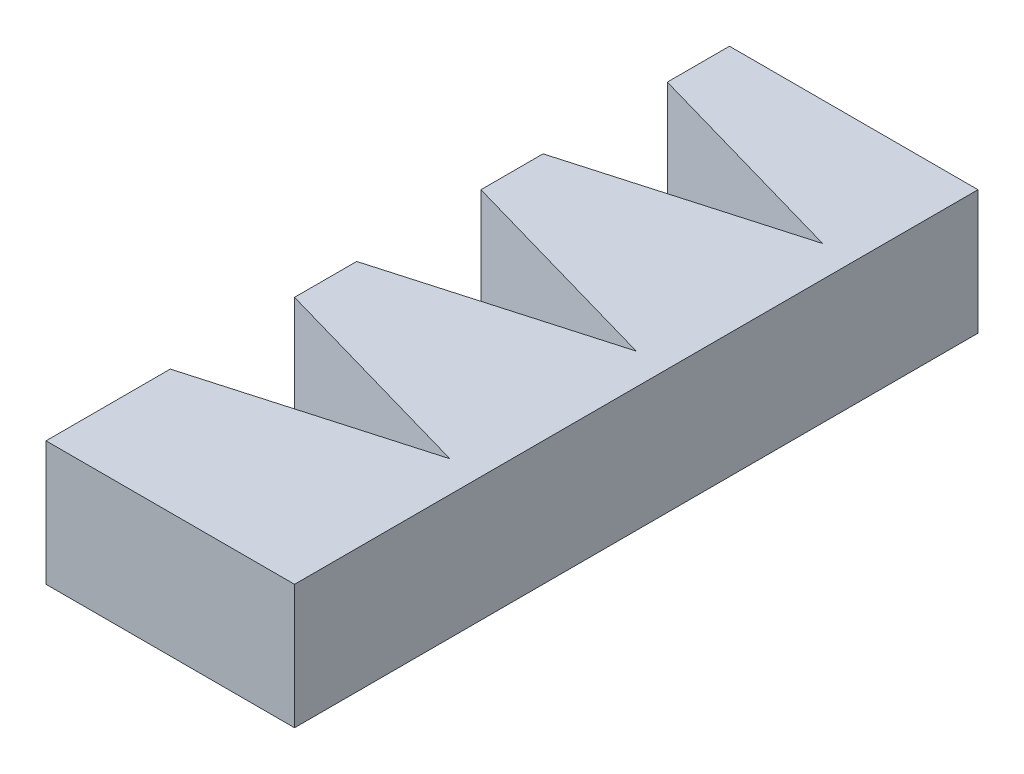
ISO-10303-21;
HEADER;
FILE_DESCRIPTION(('STEP AP214'),'2;1');
FILE_NAME('part.step','',(''),(''),'','','');
FILE_SCHEMA(('AUTOMOTIVE_DESIGN { 1 0 10303 214 1 1 1 1 }'));
ENDSEC;
DATA;
#1=APPLICATION_CONTEXT('core data for automotive mechanical design processes');
#2=APPLICATION_PROTOCOL_DEFINITION('international standard','automotive_design',2000,#1);
#3=PRODUCT_CONTEXT('',#1,'mechanical');
#4=PRODUCT('Part','Part','',(#3));
#5=PRODUCT_RELATED_PRODUCT_CATEGORY('part','',(#4));
#6=PRODUCT_DEFINITION_FORMATION('','',#4);
#7=PRODUCT_DEFINITION_CONTEXT('part definition',#1,'design');
#8=PRODUCT_DEFINITION('design','',#6,#7);
#9=PRODUCT_DEFINITION_SHAPE('','',#8);
#10=(LENGTH_UNIT() NAMED_UNIT(*) SI_UNIT(.MILLI.,.METRE.));
#11=(NAMED_UNIT(*) PLANE_ANGLE_UNIT() SI_UNIT($,.RADIAN.));
#12=(NAMED_UNIT(*) SI_UNIT($,.STERADIAN.) SOLID_ANGLE_UNIT());
#13=UNCERTAINTY_MEASURE_WITH_UNIT(LENGTH_MEASURE(1.E-05),#10,'distance_accuracy_value','');
#14=(GEOMETRIC_REPRESENTATION_CONTEXT(3) GLOBAL_UNCERTAINTY_ASSIGNED_CONTEXT((#13)) GLOBAL_UNIT_ASSIGNED_CONTEXT((#10,
#11,#12)) REPRESENTATION_CONTEXT('',''));
#15=CARTESIAN_POINT('',(0.,0.,0.));
#16=DIRECTION('',(0.,0.,1.));
#17=DIRECTION('',(1.,0.,0.));
#18=AXIS2_PLACEMENT_3D('',#15,#16,#17);
#19=CARTESIAN_POINT('',(0.,20.,0.));
#20=DIRECTION('',(1.,0.,0.));
#21=DIRECTION('',(0.,0.,-1.));
#22=AXIS2_PLACEMENT_3D('',#19,#20,#21);
#23=PLANE('',#22);
#24=DIRECTION('',(0.,0.,1.));
#25=VECTOR('',#24,1.);
#26=CARTESIAN_POINT('',(0.,0.,0.));
#27=LINE('',#26,#25);
#28=CARTESIAN_POINT('',(0.,0.,-20.));
#29=VERTEX_POINT('',#28);
#30=CARTESIAN_POINT('',(0.,0.,0.));
#31=VERTEX_POINT('',#30);
#32=EDGE_CURVE('E159',#29,#31,#27,.T.);
#33=ORIENTED_EDGE('',*,*,#32,.T.);
#34=DIRECTION('',(0.,-1.,0.));
#35=VECTOR('',#34,1.);
#36=CARTESIAN_POINT('',(0.,20.,0.));
#37=LINE('',#36,#35);
#38=CARTESIAN_POINT('',(0.,20.,0.));
#39=VERTEX_POINT('',#38);
#40=EDGE_CURVE('E11',#39,#31,#37,.T.);
#41=ORIENTED_EDGE('',*,*,#40,.F.);
#42=DIRECTION('',(0.,0.,1.));
#43=VECTOR('',#42,1.);
#44=CARTESIAN_POINT('',(0.,20.,0.));
#45=LINE('',#44,#43);
#46=CARTESIAN_POINT('',(0.,20.,-20.));
#47=VERTEX_POINT('',#46);
#48=EDGE_CURVE('E184',#47,#39,#45,.T.);
#49=ORIENTED_EDGE('',*,*,#48,.F.);
#50=DIRECTION('',(0.,-1.,0.));
#51=VECTOR('',#50,1.);
#52=CARTESIAN_POINT('',(0.,20.,-20.));
#53=LINE('',#52,#51);
#54=EDGE_CURVE('E155',#47,#29,#53,.T.);
#55=ORIENTED_EDGE('',*,*,#54,.T.);
#56=EDGE_LOOP('',(#33,#41,#49,#55));
#57=FACE_BOUND('',#56,.T.);
#58=ADVANCED_FACE('F33',(#57),#23,.F.);
#59=CARTESIAN_POINT('',(0.,20.,0.));
#60=DIRECTION('',(0.,0.,-1.));
#61=DIRECTION('',(-1.,0.,0.));
#62=AXIS2_PLACEMENT_3D('',#59,#60,#61);
#63=PLANE('',#62);
#64=DIRECTION('',(1.,0.,0.));
#65=VECTOR('',#64,1.);
#66=CARTESIAN_POINT('',(0.,0.,0.));
#67=LINE('',#66,#65);
#68=CARTESIAN_POINT('',(40.,0.,0.));
#69=VERTEX_POINT('',#68);
#70=EDGE_CURVE('E162',#31,#69,#67,.T.);
#71=ORIENTED_EDGE('',*,*,#70,.T.);
#72=DIRECTION('',(0.,-1.,0.));
#73=VECTOR('',#72,1.);
#74=CARTESIAN_POINT('',(40.,20.,0.));
#75=LINE('',#74,#73);
#76=CARTESIAN_POINT('',(40.,20.,0.));
#77=VERTEX_POINT('',#76);
#78=EDGE_CURVE('E41',#77,#69,#75,.T.);
#79=ORIENTED_EDGE('',*,*,#78,.F.);
#80=DIRECTION('',(1.,0.,0.));
#81=VECTOR('',#80,1.);
#82=CARTESIAN_POINT('',(0.,20.,0.));
#83=LINE('',#82,#81);
#84=EDGE_CURVE('E107',#39,#77,#83,.T.);
#85=ORIENTED_EDGE('',*,*,#84,.F.);
#86=ORIENTED_EDGE('',*,*,#40,.T.);
#87=EDGE_LOOP('',(#71,#79,#85,#86));
#88=FACE_BOUND('',#87,.T.);
#89=ADVANCED_FACE('F266',(#88),#63,.F.);
#90=CARTESIAN_POINT('',(40.,20.,0.));
#91=DIRECTION('',(-1.,0.,0.));
#92=DIRECTION('',(0.,0.,1.));
#93=AXIS2_PLACEMENT_3D('',#90,#91,#92);
#94=PLANE('',#93);
#95=DIRECTION('',(0.,0.,-1.));
#96=VECTOR('',#95,1.);
#97=CARTESIAN_POINT('',(40.,0.,0.));
#98=LINE('',#97,#96);
#99=CARTESIAN_POINT('',(40.,0.,-110.));
#100=VERTEX_POINT('',#99);
#101=EDGE_CURVE('E164',#69,#100,#98,.T.);
#102=ORIENTED_EDGE('',*,*,#101,.T.);
#103=DIRECTION('',(0.,-1.,0.));
#104=VECTOR('',#103,1.);
#105=CARTESIAN_POINT('',(40.,20.,-110.));
#106=LINE('',#105,#104);
#107=CARTESIAN_POINT('',(40.,20.,-110.));
#108=VERTEX_POINT('',#107);
#109=EDGE_CURVE('E206',#108,#100,#106,.T.);
#110=ORIENTED_EDGE('',*,*,#109,.F.);
#111=DIRECTION('',(0.,0.,-1.));
#112=VECTOR('',#111,1.);
#113=CARTESIAN_POINT('',(40.,20.,0.));
#114=LINE('',#113,#112);
#115=EDGE_CURVE('E214',#77,#108,#114,.T.);
#116=ORIENTED_EDGE('',*,*,#115,.F.);
#117=ORIENTED_EDGE('',*,*,#78,.T.);
#118=EDGE_LOOP('',(#102,#110,#116,#117));
#119=FACE_BOUND('',#118,.T.);
#120=ADVANCED_FACE('F212',(#119),#94,.F.);
#121=CARTESIAN_POINT('',(-3.77327389877434E-13,20.,-110.));
#122=DIRECTION('',(0.,0.,1.));
#123=DIRECTION('',(1.,0.,0.));
#124=AXIS2_PLACEMENT_3D('',#121,#122,#123);
#125=PLANE('',#124);
#126=DIRECTION('',(-1.,0.,0.));
#127=VECTOR('',#126,1.);
#128=CARTESIAN_POINT('',(-3.77327389877434E-13,0.,-110.));
#129=LINE('',#128,#127);
#130=CARTESIAN_POINT('',(-3.77327389877434E-13,0.,-110.));
#131=VERTEX_POINT('',#130);
#132=EDGE_CURVE('E167',#100,#131,#129,.T.);
#133=ORIENTED_EDGE('',*,*,#132,.T.);
#134=DIRECTION('',(0.,-1.,0.));
#135=VECTOR('',#134,1.);
#136=CARTESIAN_POINT('',(-3.77327389877434E-13,20.,-110.));
#137=LINE('',#136,#135);
#138=CARTESIAN_POINT('',(-3.77327389877434E-13,20.,-110.));
#139=VERTEX_POINT('',#138);
#140=EDGE_CURVE('E203',#139,#131,#137,.T.);
#141=ORIENTED_EDGE('',*,*,#140,.F.);
#142=DIRECTION('',(-1.,0.,0.));
#143=VECTOR('',#142,1.);
#144=CARTESIAN_POINT('',(35.,20.,-110.));
#145=LINE('',#144,#143);
#146=EDGE_CURVE('E231',#108,#139,#145,.T.);
#147=ORIENTED_EDGE('',*,*,#146,.F.);
#148=ORIENTED_EDGE('',*,*,#109,.T.);
#149=EDGE_LOOP('',(#133,#141,#147,#148));
#150=FACE_BOUND('',#149,.T.);
#151=ADVANCED_FACE('F222',(#150),#125,.F.);
#152=CARTESIAN_POINT('',(-3.43024899888577E-13,20.,-100.));
#153=DIRECTION('',(1.,0.,0.));
#154=DIRECTION('',(0.,0.,-1.));
#155=AXIS2_PLACEMENT_3D('',#152,#153,#154);
#156=PLANE('',#155);
#157=DIRECTION('',(0.,0.,1.));
#158=VECTOR('',#157,1.);
#159=CARTESIAN_POINT('',(-3.43024899888577E-13,0.,-100.));
#160=LINE('',#159,#158);
#161=CARTESIAN_POINT('',(-3.43024899888577E-13,0.,-100.));
#162=VERTEX_POINT('',#161);
#163=EDGE_CURVE('E169',#131,#162,#160,.T.);
#164=ORIENTED_EDGE('',*,*,#163,.T.);
#165=DIRECTION('',(0.,-1.,0.));
#166=VECTOR('',#165,1.);
#167=CARTESIAN_POINT('',(-3.43024899888577E-13,20.,-100.));
#168=LINE('',#167,#166);
#169=CARTESIAN_POINT('',(-3.43024899888577E-13,20.,-100.));
#170=VERTEX_POINT('',#169);
#171=EDGE_CURVE('E200',#170,#162,#168,.T.);
#172=ORIENTED_EDGE('',*,*,#171,.F.);
#173=DIRECTION('',(0.,0.,1.));
#174=VECTOR('',#173,1.);
#175=CARTESIAN_POINT('',(-3.43024899888577E-13,20.,-100.));
#176=LINE('',#175,#174);
#177=EDGE_CURVE('E228',#139,#170,#176,.T.);
#178=ORIENTED_EDGE('',*,*,#177,.F.);
#179=ORIENTED_EDGE('',*,*,#140,.T.);
#180=EDGE_LOOP('',(#164,#172,#178,#179));
#181=FACE_BOUND('',#180,.T.);
#182=ADVANCED_FACE('F226',(#181),#156,.F.);
#183=CARTESIAN_POINT('',(35.,20.,-90.));
#184=DIRECTION('',(0.274721127897376,0.,-0.961523947640824));
#185=DIRECTION('',(-0.961523947640824,0.,-0.274721127897376));
#186=AXIS2_PLACEMENT_3D('',#183,#184,#185);
#187=PLANE('',#186);
#188=DIRECTION('',(0.961523947640824,0.,0.274721127897376));
#189=VECTOR('',#188,1.);
#190=CARTESIAN_POINT('',(35.,0.,-90.));
#191=LINE('',#190,#189);
#192=CARTESIAN_POINT('',(35.,0.,-90.));
#193=VERTEX_POINT('',#192);
#194=EDGE_CURVE('E171',#162,#193,#191,.T.);
#195=ORIENTED_EDGE('',*,*,#194,.T.);
#196=DIRECTION('',(0.,-1.,0.));
#197=VECTOR('',#196,1.);
#198=CARTESIAN_POINT('',(35.,20.,-90.));
#199=LINE('',#198,#197);
#200=CARTESIAN_POINT('',(35.,20.,-90.));
#201=VERTEX_POINT('',#200);
#202=EDGE_CURVE('E197',#201,#193,#199,.T.);
#203=ORIENTED_EDGE('',*,*,#202,.F.);
#204=DIRECTION('',(0.961523947640824,0.,0.274721127897376));
#205=VECTOR('',#204,1.);
#206=CARTESIAN_POINT('',(35.,20.,-90.));
#207=LINE('',#206,#205);
#208=EDGE_CURVE('E230',#170,#201,#207,.T.);
#209=ORIENTED_EDGE('',*,*,#208,.F.);
#210=ORIENTED_EDGE('',*,*,#171,.T.);
#211=EDGE_LOOP('',(#195,#203,#209,#210));
#212=FACE_BOUND('',#211,.T.);
#213=ADVANCED_FACE('F279',(#212),#187,.F.);
#214=CARTESIAN_POINT('',(-2.74419919910861E-13,20.,-80.));
#215=DIRECTION('',(0.274721127897376,0.,0.961523947640824));
#216=DIRECTION('',(0.961523947640824,0.,-0.274721127897376));
#217=AXIS2_PLACEMENT_3D('',#214,#215,#216);
#218=PLANE('',#217);
#219=DIRECTION('',(-0.961523947640824,0.,0.274721127897376));
#220=VECTOR('',#219,1.);
#221=CARTESIAN_POINT('',(-2.74419919910861E-13,0.,-80.));
#222=LINE('',#221,#220);
#223=CARTESIAN_POINT('',(-2.74419919910861E-13,0.,-80.));
#224=VERTEX_POINT('',#223);
#225=EDGE_CURVE('E173',#193,#224,#222,.T.);
#226=ORIENTED_EDGE('',*,*,#225,.T.);
#227=DIRECTION('',(0.,-1.,0.));
#228=VECTOR('',#227,1.);
#229=CARTESIAN_POINT('',(-2.74419919910861E-13,20.,-80.));
#230=LINE('',#229,#228);
#231=CARTESIAN_POINT('',(-2.74419919910861E-13,20.,-80.));
#232=VERTEX_POINT('',#231);
#233=EDGE_CURVE('E194',#232,#224,#230,.T.);
#234=ORIENTED_EDGE('',*,*,#233,.F.);
#235=DIRECTION('',(-0.961523947640824,0.,0.274721127897376));
#236=VECTOR('',#235,1.);
#237=CARTESIAN_POINT('',(-2.74419919910861E-13,20.,-80.));
#238=LINE('',#237,#236);
#239=EDGE_CURVE('E233',#201,#232,#238,.T.);
#240=ORIENTED_EDGE('',*,*,#239,.F.);
#241=ORIENTED_EDGE('',*,*,#202,.T.);
#242=EDGE_LOOP('',(#226,#234,#240,#241));
#243=FACE_BOUND('',#242,.T.);
#244=ADVANCED_FACE('F282',(#243),#218,.F.);
#245=CARTESIAN_POINT('',(0.,20.,-70.));
#246=DIRECTION('',(1.,0.,0.));
#247=DIRECTION('',(0.,0.,-1.));
#248=AXIS2_PLACEMENT_3D('',#245,#246,#247);
#249=PLANE('',#248);
#250=DIRECTION('',(0.,0.,1.));
#251=VECTOR('',#250,1.);
#252=CARTESIAN_POINT('',(0.,0.,-70.));
#253=LINE('',#252,#251);
#254=CARTESIAN_POINT('',(0.,0.,-70.));
#255=VERTEX_POINT('',#254);
#256=EDGE_CURVE('E175',#224,#255,#253,.T.);
#257=ORIENTED_EDGE('',*,*,#256,.T.);
#258=DIRECTION('',(0.,-1.,0.));
#259=VECTOR('',#258,1.);
#260=CARTESIAN_POINT('',(0.,20.,-70.));
#261=LINE('',#260,#259);
#262=CARTESIAN_POINT('',(0.,20.,-70.));
#263=VERTEX_POINT('',#262);
#264=EDGE_CURVE('E191',#263,#255,#261,.T.);
#265=ORIENTED_EDGE('',*,*,#264,.F.);
#266=DIRECTION('',(0.,0.,1.));
#267=VECTOR('',#266,1.);
#268=CARTESIAN_POINT('',(0.,20.,-70.));
#269=LINE('',#268,#267);
#270=EDGE_CURVE('E239',#232,#263,#269,.T.);
#271=ORIENTED_EDGE('',*,*,#270,.F.);
#272=ORIENTED_EDGE('',*,*,#233,.T.);
#273=EDGE_LOOP('',(#257,#265,#271,#272));
#274=FACE_BOUND('',#273,.T.);
#275=ADVANCED_FACE('F286',(#274),#249,.F.);
#276=CARTESIAN_POINT('',(35.,20.,-60.));
#277=DIRECTION('',(0.274721127897378,0.,-0.961523947640823));
#278=DIRECTION('',(-0.961523947640823,0.,-0.274721127897378));
#279=AXIS2_PLACEMENT_3D('',#276,#277,#278);
#280=PLANE('',#279);
#281=DIRECTION('',(0.961523947640823,0.,0.274721127897378));
#282=VECTOR('',#281,1.);
#283=CARTESIAN_POINT('',(35.,0.,-60.));
#284=LINE('',#283,#282);
#285=CARTESIAN_POINT('',(35.,0.,-60.));
#286=VERTEX_POINT('',#285);
#287=EDGE_CURVE('E177',#255,#286,#284,.T.);
#288=ORIENTED_EDGE('',*,*,#287,.T.);
#289=DIRECTION('',(0.,-1.,0.));
#290=VECTOR('',#289,1.);
#291=CARTESIAN_POINT('',(35.,20.,-60.));
#292=LINE('',#291,#290);
#293=CARTESIAN_POINT('',(35.,20.,-60.));
#294=VERTEX_POINT('',#293);
#295=EDGE_CURVE('E188',#294,#286,#292,.T.);
#296=ORIENTED_EDGE('',*,*,#295,.F.);
#297=DIRECTION('',(0.961523947640823,0.,0.274721127897378));
#298=VECTOR('',#297,1.);
#299=CARTESIAN_POINT('',(35.,20.,-60.));
#300=LINE('',#299,#298);
#301=EDGE_CURVE('E241',#263,#294,#300,.T.);
#302=ORIENTED_EDGE('',*,*,#301,.F.);
#303=ORIENTED_EDGE('',*,*,#264,.T.);
#304=EDGE_LOOP('',(#288,#296,#302,#303));
#305=FACE_BOUND('',#304,.T.);
#306=ADVANCED_FACE('F247',(#305),#280,.F.);
#307=CARTESIAN_POINT('',(-1.71512449944288E-13,20.,-50.));
#308=DIRECTION('',(0.274721127897377,0.,0.961523947640824));
#309=DIRECTION('',(0.961523947640824,0.,-0.274721127897377));
#310=AXIS2_PLACEMENT_3D('',#307,#308,#309);
#311=PLANE('',#310);
#312=DIRECTION('',(-0.961523947640824,0.,0.274721127897377));
#313=VECTOR('',#312,1.);
#314=CARTESIAN_POINT('',(-1.71512449944288E-13,0.,-50.));
#315=LINE('',#314,#313);
#316=CARTESIAN_POINT('',(-1.71512449944288E-13,0.,-50.));
#317=VERTEX_POINT('',#316);
#318=EDGE_CURVE('E179',#286,#317,#315,.T.);
#319=ORIENTED_EDGE('',*,*,#318,.T.);
#320=DIRECTION('',(0.,-1.,0.));
#321=VECTOR('',#320,1.);
#322=CARTESIAN_POINT('',(-1.71512449944288E-13,20.,-50.));
#323=LINE('',#322,#321);
#324=CARTESIAN_POINT('',(-1.71512449944288E-13,20.,-50.));
#325=VERTEX_POINT('',#324);
#326=EDGE_CURVE('E150',#325,#317,#323,.T.);
#327=ORIENTED_EDGE('',*,*,#326,.F.);
#328=DIRECTION('',(-0.961523947640824,0.,0.274721127897377));
#329=VECTOR('',#328,1.);
#330=CARTESIAN_POINT('',(-1.71512449944288E-13,20.,-50.));
#331=LINE('',#330,#329);
#332=EDGE_CURVE('E141',#294,#325,#331,.T.);
#333=ORIENTED_EDGE('',*,*,#332,.F.);
#334=ORIENTED_EDGE('',*,*,#295,.T.);
#335=EDGE_LOOP('',(#319,#327,#333,#334));
#336=FACE_BOUND('',#335,.T.);
#337=ADVANCED_FACE('F251',(#336),#311,.F.);
#338=CARTESIAN_POINT('',(-1.37209959955431E-13,20.,-40.));
#339=DIRECTION('',(1.,0.,0.));
#340=DIRECTION('',(0.,0.,-1.));
#341=AXIS2_PLACEMENT_3D('',#338,#339,#340);
#342=PLANE('',#341);
#343=DIRECTION('',(0.,0.,1.));
#344=VECTOR('',#343,1.);
#345=CARTESIAN_POINT('',(-1.37209959955431E-13,0.,-40.));
#346=LINE('',#345,#344);
#347=CARTESIAN_POINT('',(-1.37209959955431E-13,0.,-40.));
#348=VERTEX_POINT('',#347);
#349=EDGE_CURVE('E149',#317,#348,#346,.T.);
#350=ORIENTED_EDGE('',*,*,#349,.T.);
#351=DIRECTION('',(0.,-1.,0.));
#352=VECTOR('',#351,1.);
#353=CARTESIAN_POINT('',(-1.37209959955431E-13,20.,-40.));
#354=LINE('',#353,#352);
#355=CARTESIAN_POINT('',(-1.37209959955431E-13,20.,-40.));
#356=VERTEX_POINT('',#355);
#357=EDGE_CURVE('E146',#356,#348,#354,.T.);
#358=ORIENTED_EDGE('',*,*,#357,.F.);
#359=DIRECTION('',(0.,0.,1.));
#360=VECTOR('',#359,1.);
#361=CARTESIAN_POINT('',(-1.37209959955431E-13,20.,-40.));
#362=LINE('',#361,#360);
#363=EDGE_CURVE('E135',#325,#356,#362,.T.);
#364=ORIENTED_EDGE('',*,*,#363,.F.);
#365=ORIENTED_EDGE('',*,*,#326,.T.);
#366=EDGE_LOOP('',(#350,#358,#364,#365));
#367=FACE_BOUND('',#366,.T.);
#368=ADVANCED_FACE('F147',(#367),#342,.F.);
#369=CARTESIAN_POINT('',(35.,20.,-30.));
#370=DIRECTION('',(0.274721127897377,0.,-0.961523947640823));
#371=DIRECTION('',(-0.961523947640823,0.,-0.274721127897377));
#372=AXIS2_PLACEMENT_3D('',#369,#370,#371);
#373=PLANE('',#372);
#374=DIRECTION('',(0.961523947640823,0.,0.274721127897377));
#375=VECTOR('',#374,1.);
#376=CARTESIAN_POINT('',(35.,0.,-30.));
#377=LINE('',#376,#375);
#378=CARTESIAN_POINT('',(35.,0.,-30.));
#379=VERTEX_POINT('',#378);
#380=EDGE_CURVE('E93',#348,#379,#377,.T.);
#381=ORIENTED_EDGE('',*,*,#380,.T.);
#382=DIRECTION('',(0.,-1.,0.));
#383=VECTOR('',#382,1.);
#384=CARTESIAN_POINT('',(35.,20.,-30.));
#385=LINE('',#384,#383);
#386=CARTESIAN_POINT('',(35.,20.,-30.));
#387=VERTEX_POINT('',#386);
#388=EDGE_CURVE('E151',#387,#379,#385,.T.);
#389=ORIENTED_EDGE('',*,*,#388,.F.);
#390=DIRECTION('',(0.961523947640823,0.,0.274721127897377));
#391=VECTOR('',#390,1.);
#392=CARTESIAN_POINT('',(35.,20.,-30.));
#393=LINE('',#392,#391);
#394=EDGE_CURVE('E139',#356,#387,#393,.T.);
#395=ORIENTED_EDGE('',*,*,#394,.F.);
#396=ORIENTED_EDGE('',*,*,#357,.T.);
#397=EDGE_LOOP('',(#381,#389,#395,#396));
#398=FACE_BOUND('',#397,.T.);
#399=ADVANCED_FACE('F153',(#398),#373,.F.);
#400=CARTESIAN_POINT('',(0.,20.,-20.));
#401=DIRECTION('',(0.274721127897377,0.,0.961523947640823));
#402=DIRECTION('',(0.961523947640823,0.,-0.274721127897377));
#403=AXIS2_PLACEMENT_3D('',#400,#401,#402);
#404=PLANE('',#403);
#405=DIRECTION('',(-0.961523947640823,0.,0.274721127897377));
#406=VECTOR('',#405,1.);
#407=CARTESIAN_POINT('',(0.,0.,-20.));
#408=LINE('',#407,#406);
#409=EDGE_CURVE('E99',#379,#29,#408,.T.);
#410=ORIENTED_EDGE('',*,*,#409,.T.);
#411=ORIENTED_EDGE('',*,*,#54,.F.);
#412=DIRECTION('',(-0.961523947640823,0.,0.274721127897377));
#413=VECTOR('',#412,1.);
#414=CARTESIAN_POINT('',(0.,20.,-20.));
#415=LINE('',#414,#413);
#416=EDGE_CURVE('E49',#387,#47,#415,.T.);
#417=ORIENTED_EDGE('',*,*,#416,.F.);
#418=ORIENTED_EDGE('',*,*,#388,.T.);
#419=EDGE_LOOP('',(#410,#411,#417,#418));
#420=FACE_BOUND('',#419,.T.);
#421=ADVANCED_FACE('F255',(#420),#404,.F.);
#422=CARTESIAN_POINT('',(0.,20.,0.));
#423=DIRECTION('',(0.,-1.,0.));
#424=DIRECTION('',(0.,0.,-1.));
#425=AXIS2_PLACEMENT_3D('',#422,#423,#424);
#426=PLANE('',#425);
#427=ORIENTED_EDGE('',*,*,#48,.T.);
#428=ORIENTED_EDGE('',*,*,#84,.T.);
#429=ORIENTED_EDGE('',*,*,#115,.T.);
#430=ORIENTED_EDGE('',*,*,#146,.T.);
#431=ORIENTED_EDGE('',*,*,#177,.T.);
#432=ORIENTED_EDGE('',*,*,#208,.T.);
#433=ORIENTED_EDGE('',*,*,#239,.T.);
#434=ORIENTED_EDGE('',*,*,#270,.T.);
#435=ORIENTED_EDGE('',*,*,#301,.T.);
#436=ORIENTED_EDGE('',*,*,#332,.T.);
#437=ORIENTED_EDGE('',*,*,#363,.T.);
#438=ORIENTED_EDGE('',*,*,#394,.T.);
#439=ORIENTED_EDGE('',*,*,#416,.T.);
#440=EDGE_LOOP('',(#427,#428,#429,#430,#431,#432,#433,#434,#435,#436,#437,#438,#439));
#441=FACE_BOUND('',#440,.T.);
#442=ADVANCED_FACE('F137',(#441),#426,.F.);
#443=CARTESIAN_POINT('',(0.,0.,0.));
#444=DIRECTION('',(0.,-1.,0.));
#445=DIRECTION('',(0.,0.,-1.));
#446=AXIS2_PLACEMENT_3D('',#443,#444,#445);
#447=PLANE('',#446);
#448=ORIENTED_EDGE('',*,*,#32,.F.);
#449=ORIENTED_EDGE('',*,*,#409,.F.);
#450=ORIENTED_EDGE('',*,*,#380,.F.);
#451=ORIENTED_EDGE('',*,*,#349,.F.);
#452=ORIENTED_EDGE('',*,*,#318,.F.);
#453=ORIENTED_EDGE('',*,*,#287,.F.);
#454=ORIENTED_EDGE('',*,*,#256,.F.);
#455=ORIENTED_EDGE('',*,*,#225,.F.);
#456=ORIENTED_EDGE('',*,*,#194,.F.);
#457=ORIENTED_EDGE('',*,*,#163,.F.);
#458=ORIENTED_EDGE('',*,*,#132,.F.);
#459=ORIENTED_EDGE('',*,*,#101,.F.);
#460=ORIENTED_EDGE('',*,*,#70,.F.);
#461=EDGE_LOOP('',(#448,#449,#450,#451,#452,#453,#454,#455,#456,#457,#458,#459,#460));
#462=FACE_BOUND('',#461,.T.);
#463=ADVANCED_FACE('F217',(#462),#447,.T.);
#464=CLOSED_SHELL('',(#58,#89,#120,#151,#182,#213,#244,#275,#306,#337,#368,#399,#421,#442,#463));
#465=MANIFOLD_SOLID_BREP('B2',#464);
#466=ADVANCED_BREP_SHAPE_REPRESENTATION('',(#18,#465),#14);
#467=SHAPE_DEFINITION_REPRESENTATION(#9,#466);
ENDSEC;
END-ISO-10303-21;
